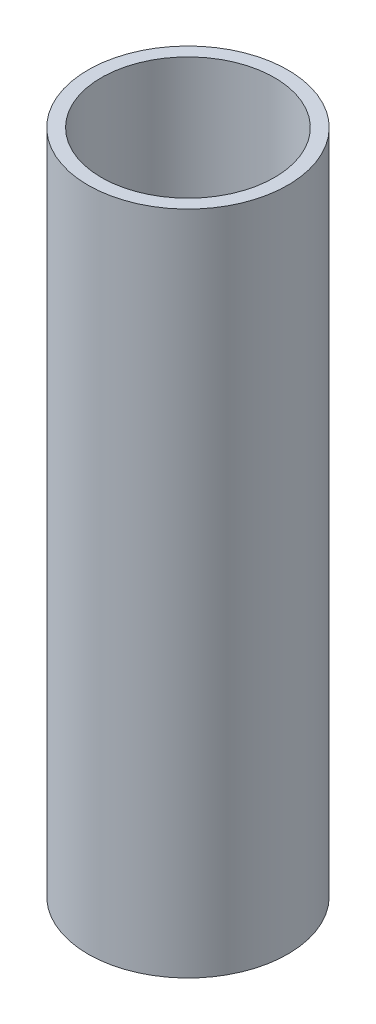
ISO-10303-21;
HEADER;
FILE_DESCRIPTION(('STEP AP214'),'2;1');
FILE_NAME('part.step','',(''),(''),'','','');
FILE_SCHEMA(('AUTOMOTIVE_DESIGN { 1 0 10303 214 1 1 1 1 }'));
ENDSEC;
DATA;
#1=APPLICATION_CONTEXT('core data for automotive mechanical design processes');
#2=APPLICATION_PROTOCOL_DEFINITION('international standard','automotive_design',2000,#1);
#3=PRODUCT_CONTEXT('',#1,'mechanical');
#4=PRODUCT('Part','Part','',(#3));
#5=PRODUCT_RELATED_PRODUCT_CATEGORY('part','',(#4));
#6=PRODUCT_DEFINITION_FORMATION('','',#4);
#7=PRODUCT_DEFINITION_CONTEXT('part definition',#1,'design');
#8=PRODUCT_DEFINITION('design','',#6,#7);
#9=PRODUCT_DEFINITION_SHAPE('','',#8);
#10=(LENGTH_UNIT() NAMED_UNIT(*) SI_UNIT(.MILLI.,.METRE.));
#11=(NAMED_UNIT(*) PLANE_ANGLE_UNIT() SI_UNIT($,.RADIAN.));
#12=(NAMED_UNIT(*) SI_UNIT($,.STERADIAN.) SOLID_ANGLE_UNIT());
#13=UNCERTAINTY_MEASURE_WITH_UNIT(LENGTH_MEASURE(1.E-05),#10,'distance_accuracy_value','');
#14=(GEOMETRIC_REPRESENTATION_CONTEXT(3) GLOBAL_UNCERTAINTY_ASSIGNED_CONTEXT((#13)) GLOBAL_UNIT_ASSIGNED_CONTEXT((#10,
#11,#12)) REPRESENTATION_CONTEXT('',''));
#15=CARTESIAN_POINT('',(0.,0.,0.));
#16=DIRECTION('',(0.,0.,1.));
#17=DIRECTION('',(1.,0.,0.));
#18=AXIS2_PLACEMENT_3D('',#15,#16,#17);
#19=CARTESIAN_POINT('',(0.,100.,0.));
#20=DIRECTION('',(0.,1.,0.));
#21=DIRECTION('',(0.,0.,1.));
#22=AXIS2_PLACEMENT_3D('',#19,#20,#21);
#23=PLANE('',#22);
#24=CARTESIAN_POINT('',(0.,100.,0.));
#25=DIRECTION('',(0.,1.,0.));
#26=DIRECTION('',(0.,0.,1.));
#27=AXIS2_PLACEMENT_3D('',#24,#25,#26);
#28=CIRCLE('',#27,15.);
#29=CARTESIAN_POINT('',(0.,100.,15.));
#30=VERTEX_POINT('',#29);
#31=EDGE_CURVE('E10',#30,#30,#28,.T.);
#32=ORIENTED_EDGE('',*,*,#31,.T.);
#33=EDGE_LOOP('',(#32));
#34=FACE_BOUND('',#33,.T.);
#35=CARTESIAN_POINT('',(0.,100.,0.));
#36=DIRECTION('',(0.,1.,0.));
#37=DIRECTION('',(0.,0.,1.));
#38=AXIS2_PLACEMENT_3D('',#35,#36,#37);
#39=CIRCLE('',#38,13.);
#40=CARTESIAN_POINT('',(0.,100.,13.));
#41=VERTEX_POINT('',#40);
#42=EDGE_CURVE('E46',#41,#41,#39,.T.);
#43=ORIENTED_EDGE('',*,*,#42,.F.);
#44=EDGE_LOOP('',(#43));
#45=FACE_BOUND('',#44,.T.);
#46=ADVANCED_FACE('F35',(#34,#45),#23,.T.);
#47=CARTESIAN_POINT('',(0.,0.,0.));
#48=DIRECTION('',(0.,1.,0.));
#49=DIRECTION('',(0.,0.,1.));
#50=AXIS2_PLACEMENT_3D('',#47,#48,#49);
#51=PLANE('',#50);
#52=CARTESIAN_POINT('',(0.,0.,0.));
#53=DIRECTION('',(0.,1.,0.));
#54=DIRECTION('',(0.,0.,1.));
#55=AXIS2_PLACEMENT_3D('',#52,#53,#54);
#56=CIRCLE('',#55,15.);
#57=CARTESIAN_POINT('',(0.,0.,15.));
#58=VERTEX_POINT('',#57);
#59=EDGE_CURVE('E39',#58,#58,#56,.T.);
#60=ORIENTED_EDGE('',*,*,#59,.F.);
#61=EDGE_LOOP('',(#60));
#62=FACE_BOUND('',#61,.T.);
#63=CARTESIAN_POINT('',(0.,0.,0.));
#64=DIRECTION('',(0.,1.,0.));
#65=DIRECTION('',(0.,0.,1.));
#66=AXIS2_PLACEMENT_3D('',#63,#64,#65);
#67=CIRCLE('',#66,13.);
#68=CARTESIAN_POINT('',(0.,0.,13.));
#69=VERTEX_POINT('',#68);
#70=EDGE_CURVE('E48',#69,#69,#67,.T.);
#71=ORIENTED_EDGE('',*,*,#70,.T.);
#72=EDGE_LOOP('',(#71));
#73=FACE_BOUND('',#72,.T.);
#74=ADVANCED_FACE('F58',(#62,#73),#51,.F.);
#75=CARTESIAN_POINT('',(0.,100.,0.));
#76=DIRECTION('',(0.,-1.,0.));
#77=DIRECTION('',(0.,0.,-1.));
#78=AXIS2_PLACEMENT_3D('',#75,#76,#77);
#79=CYLINDRICAL_SURFACE('',#78,15.);
#80=ORIENTED_EDGE('',*,*,#31,.F.);
#81=EDGE_LOOP('',(#80));
#82=FACE_BOUND('',#81,.T.);
#83=ORIENTED_EDGE('',*,*,#59,.T.);
#84=EDGE_LOOP('',(#83));
#85=FACE_BOUND('',#84,.T.);
#86=ADVANCED_FACE('F37',(#82,#85),#79,.T.);
#87=CARTESIAN_POINT('',(0.,100.,0.));
#88=DIRECTION('',(0.,-1.,0.));
#89=DIRECTION('',(0.,0.,-1.));
#90=AXIS2_PLACEMENT_3D('',#87,#88,#89);
#91=CYLINDRICAL_SURFACE('',#90,13.);
#92=ORIENTED_EDGE('',*,*,#42,.T.);
#93=EDGE_LOOP('',(#92));
#94=FACE_BOUND('',#93,.T.);
#95=ORIENTED_EDGE('',*,*,#70,.F.);
#96=EDGE_LOOP('',(#95));
#97=FACE_BOUND('',#96,.T.);
#98=ADVANCED_FACE('F54',(#94,#97),#91,.F.);
#99=CLOSED_SHELL('',(#46,#74,#86,#98));
#100=MANIFOLD_SOLID_BREP('B2',#99);
#101=ADVANCED_BREP_SHAPE_REPRESENTATION('',(#18,#100),#14);
#102=SHAPE_DEFINITION_REPRESENTATION(#9,#101);
ENDSEC;
END-ISO-10303-21;
